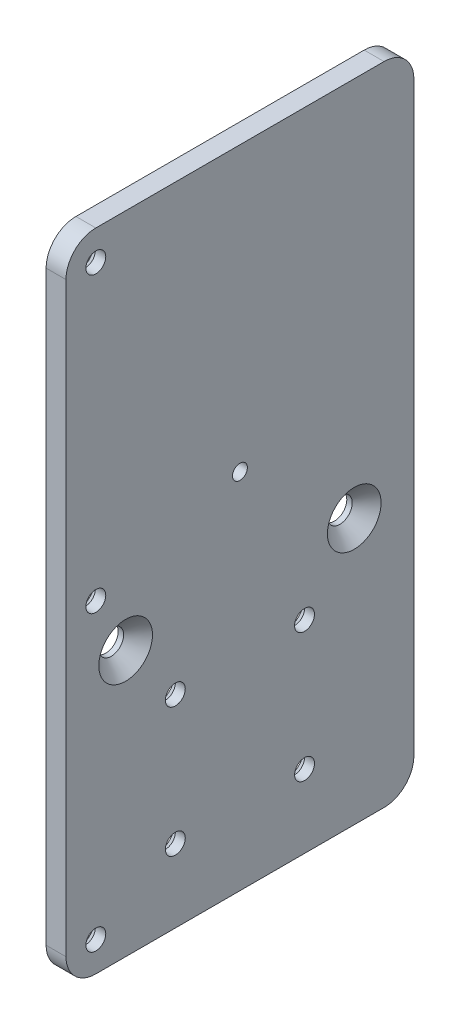
ISO-10303-21;
HEADER;
FILE_DESCRIPTION(('STEP AP214'),'2;1');
FILE_NAME('part.step','',(''),(''),'','','');
FILE_SCHEMA(('AUTOMOTIVE_DESIGN { 1 0 10303 214 1 1 1 1 }'));
ENDSEC;
DATA;
#1=APPLICATION_CONTEXT('core data for automotive mechanical design processes');
#2=APPLICATION_PROTOCOL_DEFINITION('international standard','automotive_design',2000,#1);
#3=PRODUCT_CONTEXT('',#1,'mechanical');
#4=PRODUCT('Part','Part','',(#3));
#5=PRODUCT_RELATED_PRODUCT_CATEGORY('part','',(#4));
#6=PRODUCT_DEFINITION_FORMATION('','',#4);
#7=PRODUCT_DEFINITION_CONTEXT('part definition',#1,'design');
#8=PRODUCT_DEFINITION('design','',#6,#7);
#9=PRODUCT_DEFINITION_SHAPE('','',#8);
#10=(LENGTH_UNIT() NAMED_UNIT(*) SI_UNIT(.MILLI.,.METRE.));
#11=(NAMED_UNIT(*) PLANE_ANGLE_UNIT() SI_UNIT($,.RADIAN.));
#12=(NAMED_UNIT(*) SI_UNIT($,.STERADIAN.) SOLID_ANGLE_UNIT());
#13=UNCERTAINTY_MEASURE_WITH_UNIT(LENGTH_MEASURE(1.E-05),#10,'distance_accuracy_value','');
#14=(GEOMETRIC_REPRESENTATION_CONTEXT(3) GLOBAL_UNCERTAINTY_ASSIGNED_CONTEXT((#13)) GLOBAL_UNIT_ASSIGNED_CONTEXT((#10,
#11,#12)) REPRESENTATION_CONTEXT('',''));
#15=CARTESIAN_POINT('',(0.,0.,0.));
#16=DIRECTION('',(0.,0.,1.));
#17=DIRECTION('',(1.,0.,0.));
#18=AXIS2_PLACEMENT_3D('',#15,#16,#17);
#19=CARTESIAN_POINT('',(4.,61.0681664666984,19.9981468209628));
#20=DIRECTION('',(0.,0.,-1.));
#21=DIRECTION('',(0.,1.,0.));
#22=AXIS2_PLACEMENT_3D('',#19,#20,#21);
#23=PLANE('',#22);
#24=DIRECTION('',(0.,-1.,0.));
#25=VECTOR('',#24,1.);
#26=CARTESIAN_POINT('',(0.,61.0681664666984,19.9981468209628));
#27=LINE('',#26,#25);
#28=CARTESIAN_POINT('',(0.,55.0681664666984,19.9981468209628));
#29=VERTEX_POINT('',#28);
#30=CARTESIAN_POINT('',(0.,-62.9318335333016,19.9981468209627));
#31=VERTEX_POINT('',#30);
#32=EDGE_CURVE('E131',#29,#31,#27,.T.);
#33=ORIENTED_EDGE('',*,*,#32,.T.);
#34=DIRECTION('',(-1.,0.,0.));
#35=VECTOR('',#34,1.);
#36=CARTESIAN_POINT('',(4.,-62.9318335333016,19.9981468209627));
#37=LINE('',#36,#35);
#38=CARTESIAN_POINT('',(4.,-62.9318335333016,19.9981468209627));
#39=VERTEX_POINT('',#38);
#40=EDGE_CURVE('E153',#31,#39,#37,.F.);
#41=ORIENTED_EDGE('',*,*,#40,.T.);
#42=DIRECTION('',(0.,-1.,0.));
#43=VECTOR('',#42,1.);
#44=CARTESIAN_POINT('',(4.,61.0681664666984,19.9981468209628));
#45=LINE('',#44,#43);
#46=CARTESIAN_POINT('',(4.,55.0681664666984,19.9981468209628));
#47=VERTEX_POINT('',#46);
#48=EDGE_CURVE('E129',#47,#39,#45,.T.);
#49=ORIENTED_EDGE('',*,*,#48,.F.);
#50=DIRECTION('',(-1.,0.,0.));
#51=VECTOR('',#50,1.);
#52=CARTESIAN_POINT('',(4.,55.0681664666984,19.9981468209628));
#53=LINE('',#52,#51);
#54=EDGE_CURVE('E150',#47,#29,#53,.T.);
#55=ORIENTED_EDGE('',*,*,#54,.T.);
#56=EDGE_LOOP('',(#33,#41,#49,#55));
#57=FACE_BOUND('',#56,.T.);
#58=ADVANCED_FACE('F33',(#57),#23,.F.);
#59=CARTESIAN_POINT('',(4.,-68.9318335333016,19.9981468209627));
#60=DIRECTION('',(0.,1.,0.));
#61=DIRECTION('',(0.,0.,1.));
#62=AXIS2_PLACEMENT_3D('',#59,#60,#61);
#63=PLANE('',#62);
#64=DIRECTION('',(0.,0.,-1.));
#65=VECTOR('',#64,1.);
#66=CARTESIAN_POINT('',(0.,-68.9318335333016,19.9981468209627));
#67=LINE('',#66,#65);
#68=CARTESIAN_POINT('',(0.,-68.9318335333016,13.9981468209627));
#69=VERTEX_POINT('',#68);
#70=CARTESIAN_POINT('',(0.,-68.9318335333016,-44.0018531790372));
#71=VERTEX_POINT('',#70);
#72=EDGE_CURVE('E127',#69,#71,#67,.T.);
#73=ORIENTED_EDGE('',*,*,#72,.T.);
#74=DIRECTION('',(-1.,0.,0.));
#75=VECTOR('',#74,1.);
#76=CARTESIAN_POINT('',(4.,-68.9318335333016,-44.0018531790372));
#77=LINE('',#76,#75);
#78=CARTESIAN_POINT('',(4.,-68.9318335333016,-44.0018531790372));
#79=VERTEX_POINT('',#78);
#80=EDGE_CURVE('E105',#71,#79,#77,.F.);
#81=ORIENTED_EDGE('',*,*,#80,.T.);
#82=DIRECTION('',(0.,0.,-1.));
#83=VECTOR('',#82,1.);
#84=CARTESIAN_POINT('',(4.,-68.9318335333016,19.9981468209627));
#85=LINE('',#84,#83);
#86=CARTESIAN_POINT('',(4.,-68.9318335333016,13.9981468209627));
#87=VERTEX_POINT('',#86);
#88=EDGE_CURVE('E279',#87,#79,#85,.T.);
#89=ORIENTED_EDGE('',*,*,#88,.F.);
#90=DIRECTION('',(-1.,0.,0.));
#91=VECTOR('',#90,1.);
#92=CARTESIAN_POINT('',(4.,-68.9318335333016,13.9981468209627));
#93=LINE('',#92,#91);
#94=EDGE_CURVE('E110',#87,#69,#93,.T.);
#95=ORIENTED_EDGE('',*,*,#94,.T.);
#96=EDGE_LOOP('',(#73,#81,#89,#95));
#97=FACE_BOUND('',#96,.T.);
#98=ADVANCED_FACE('F298',(#97),#63,.F.);
#99=CARTESIAN_POINT('',(4.,61.0681664666984,-50.0018531790372));
#100=DIRECTION('',(0.,0.,1.));
#101=DIRECTION('',(0.,-1.,0.));
#102=AXIS2_PLACEMENT_3D('',#99,#100,#101);
#103=PLANE('',#102);
#104=DIRECTION('',(0.,1.,0.));
#105=VECTOR('',#104,1.);
#106=CARTESIAN_POINT('',(4.,61.0681664666984,-50.0018531790372));
#107=LINE('',#106,#105);
#108=CARTESIAN_POINT('',(4.,-62.9318335333016,-50.0018531790373));
#109=VERTEX_POINT('',#108);
#110=CARTESIAN_POINT('',(4.,55.0681664666984,-50.0018531790372));
#111=VERTEX_POINT('',#110);
#112=EDGE_CURVE('E119',#109,#111,#107,.T.);
#113=ORIENTED_EDGE('',*,*,#112,.F.);
#114=DIRECTION('',(-1.,0.,0.));
#115=VECTOR('',#114,1.);
#116=CARTESIAN_POINT('',(4.,-62.9318335333016,-50.0018531790373));
#117=LINE('',#116,#115);
#118=CARTESIAN_POINT('',(0.,-62.9318335333016,-50.0018531790373));
#119=VERTEX_POINT('',#118);
#120=EDGE_CURVE('E104',#109,#119,#117,.T.);
#121=ORIENTED_EDGE('',*,*,#120,.T.);
#122=DIRECTION('',(0.,1.,0.));
#123=VECTOR('',#122,1.);
#124=CARTESIAN_POINT('',(0.,61.0681664666984,-50.0018531790372));
#125=LINE('',#124,#123);
#126=CARTESIAN_POINT('',(0.,55.0681664666984,-50.0018531790372));
#127=VERTEX_POINT('',#126);
#128=EDGE_CURVE('E117',#119,#127,#125,.T.);
#129=ORIENTED_EDGE('',*,*,#128,.T.);
#130=DIRECTION('',(-1.,0.,0.));
#131=VECTOR('',#130,1.);
#132=CARTESIAN_POINT('',(4.,55.0681664666984,-50.0018531790372));
#133=LINE('',#132,#131);
#134=EDGE_CURVE('E121',#127,#111,#133,.F.);
#135=ORIENTED_EDGE('',*,*,#134,.T.);
#136=EDGE_LOOP('',(#113,#121,#129,#135));
#137=FACE_BOUND('',#136,.T.);
#138=ADVANCED_FACE('F116',(#137),#103,.F.);
#139=CARTESIAN_POINT('',(4.,61.0681664666984,19.9981468209628));
#140=DIRECTION('',(0.,-1.,0.));
#141=DIRECTION('',(0.,0.,-1.));
#142=AXIS2_PLACEMENT_3D('',#139,#140,#141);
#143=PLANE('',#142);
#144=DIRECTION('',(0.,0.,1.));
#145=VECTOR('',#144,1.);
#146=CARTESIAN_POINT('',(4.,61.0681664666984,19.9981468209628));
#147=LINE('',#146,#145);
#148=CARTESIAN_POINT('',(4.,61.0681664666984,-44.0018531790372));
#149=VERTEX_POINT('',#148);
#150=CARTESIAN_POINT('',(4.,61.0681664666984,13.9981468209628));
#151=VERTEX_POINT('',#150);
#152=EDGE_CURVE('E135',#149,#151,#147,.T.);
#153=ORIENTED_EDGE('',*,*,#152,.F.);
#154=DIRECTION('',(-1.,0.,0.));
#155=VECTOR('',#154,1.);
#156=CARTESIAN_POINT('',(4.,61.0681664666984,-44.0018531790372));
#157=LINE('',#156,#155);
#158=CARTESIAN_POINT('',(0.,61.0681664666984,-44.0018531790372));
#159=VERTEX_POINT('',#158);
#160=EDGE_CURVE('E156',#149,#159,#157,.T.);
#161=ORIENTED_EDGE('',*,*,#160,.T.);
#162=DIRECTION('',(0.,0.,1.));
#163=VECTOR('',#162,1.);
#164=CARTESIAN_POINT('',(0.,61.0681664666984,19.9981468209628));
#165=LINE('',#164,#163);
#166=CARTESIAN_POINT('',(0.,61.0681664666984,13.9981468209628));
#167=VERTEX_POINT('',#166);
#168=EDGE_CURVE('E126',#159,#167,#165,.T.);
#169=ORIENTED_EDGE('',*,*,#168,.T.);
#170=DIRECTION('',(-1.,0.,0.));
#171=VECTOR('',#170,1.);
#172=CARTESIAN_POINT('',(4.,61.0681664666984,13.9981468209628));
#173=LINE('',#172,#171);
#174=EDGE_CURVE('E48',#167,#151,#173,.F.);
#175=ORIENTED_EDGE('',*,*,#174,.T.);
#176=EDGE_LOOP('',(#153,#161,#169,#175));
#177=FACE_BOUND('',#176,.T.);
#178=ADVANCED_FACE('F301',(#177),#143,.F.);
#179=CARTESIAN_POINT('',(4.,0.,0.));
#180=DIRECTION('',(1.,0.,0.));
#181=DIRECTION('',(0.,0.,-1.));
#182=AXIS2_PLACEMENT_3D('',#179,#180,#181);
#183=PLANE('',#182);
#184=CARTESIAN_POINT('',(4.,4.06816646669843,-15.0018531790373));
#185=DIRECTION('',(1.,0.,0.));
#186=DIRECTION('',(0.,0.,-1.));
#187=AXIS2_PLACEMENT_3D('',#184,#185,#186);
#188=CIRCLE('',#187,1.5);
#189=CARTESIAN_POINT('',(4.,4.06816646669843,-16.5018531790373));
#190=VERTEX_POINT('',#189);
#191=EDGE_CURVE('E209',#190,#190,#188,.T.);
#192=ORIENTED_EDGE('',*,*,#191,.F.);
#193=EDGE_LOOP('',(#192));
#194=FACE_BOUND('',#193,.T.);
#195=CARTESIAN_POINT('',(4.,-15.531833533305,-38.0018531790323));
#196=DIRECTION('',(1.,0.,0.));
#197=DIRECTION('',(0.,0.,-1.));
#198=AXIS2_PLACEMENT_3D('',#195,#196,#197);
#199=CIRCLE('',#198,5.40000000000516);
#200=CARTESIAN_POINT('',(4.,-15.531833533305,-43.4018531790375));
#201=VERTEX_POINT('',#200);
#202=EDGE_CURVE('E41',#201,#201,#199,.F.);
#203=ORIENTED_EDGE('',*,*,#202,.T.);
#204=EDGE_LOOP('',(#203));
#205=FACE_BOUND('',#204,.T.);
#206=CARTESIAN_POINT('',(4.,-15.531833533305,7.99814682096768));
#207=DIRECTION('',(1.,0.,0.));
#208=DIRECTION('',(0.,0.,-1.));
#209=AXIS2_PLACEMENT_3D('',#206,#207,#208);
#210=CIRCLE('',#209,5.40000000000512);
#211=CARTESIAN_POINT('',(4.,-15.531833533305,2.59814682096255));
#212=VERTEX_POINT('',#211);
#213=EDGE_CURVE('E212',#212,#212,#210,.F.);
#214=ORIENTED_EDGE('',*,*,#213,.T.);
#215=EDGE_LOOP('',(#214));
#216=FACE_BOUND('',#215,.T.);
#217=CARTESIAN_POINT('',(4.,-3.93183353330157,13.9981468209628));
#218=DIRECTION('',(1.,0.,0.));
#219=DIRECTION('',(0.,0.,-1.));
#220=AXIS2_PLACEMENT_3D('',#217,#218,#219);
#221=CIRCLE('',#220,2.);
#222=CARTESIAN_POINT('',(4.,-3.93183353330157,11.9981468209628));
#223=VERTEX_POINT('',#222);
#224=EDGE_CURVE('E205',#223,#223,#221,.T.);
#225=ORIENTED_EDGE('',*,*,#224,.F.);
#226=EDGE_LOOP('',(#225));
#227=FACE_BOUND('',#226,.T.);
#228=CARTESIAN_POINT('',(4.,-62.9318335333016,13.9981468209627));
#229=DIRECTION('',(1.,0.,0.));
#230=DIRECTION('',(0.,0.,-1.));
#231=AXIS2_PLACEMENT_3D('',#228,#229,#230);
#232=CIRCLE('',#231,2.);
#233=CARTESIAN_POINT('',(4.,-62.9318335333016,11.9981468209627));
#234=VERTEX_POINT('',#233);
#235=EDGE_CURVE('E364',#234,#234,#232,.T.);
#236=ORIENTED_EDGE('',*,*,#235,.F.);
#237=EDGE_LOOP('',(#236));
#238=FACE_BOUND('',#237,.T.);
#239=CARTESIAN_POINT('',(4.,55.0681664666984,13.9981468209628));
#240=DIRECTION('',(1.,0.,0.));
#241=DIRECTION('',(0.,0.,-1.));
#242=AXIS2_PLACEMENT_3D('',#239,#240,#241);
#243=CIRCLE('',#242,2.);
#244=CARTESIAN_POINT('',(4.,55.0681664666984,11.9981468209628));
#245=VERTEX_POINT('',#244);
#246=EDGE_CURVE('E366',#245,#245,#243,.T.);
#247=ORIENTED_EDGE('',*,*,#246,.F.);
#248=EDGE_LOOP('',(#247));
#249=FACE_BOUND('',#248,.T.);
#250=CARTESIAN_POINT('',(4.,-54.2317335333019,-2.00165317903681));
#251=DIRECTION('',(1.,0.,0.));
#252=DIRECTION('',(0.,0.,-1.));
#253=AXIS2_PLACEMENT_3D('',#250,#251,#252);
#254=CIRCLE('',#253,2.);
#255=CARTESIAN_POINT('',(4.,-54.2317335333019,-4.00165317903681));
#256=VERTEX_POINT('',#255);
#257=EDGE_CURVE('E369',#256,#256,#254,.T.);
#258=ORIENTED_EDGE('',*,*,#257,.F.);
#259=EDGE_LOOP('',(#258));
#260=FACE_BOUND('',#259,.T.);
#261=CARTESIAN_POINT('',(4.,-28.2317335333019,-2.00165317903681));
#262=DIRECTION('',(1.,0.,0.));
#263=DIRECTION('',(0.,0.,-1.));
#264=AXIS2_PLACEMENT_3D('',#261,#262,#263);
#265=CIRCLE('',#264,2.);
#266=CARTESIAN_POINT('',(4.,-28.2317335333019,-4.00165317903681));
#267=VERTEX_POINT('',#266);
#268=EDGE_CURVE('E273',#267,#267,#265,.T.);
#269=ORIENTED_EDGE('',*,*,#268,.F.);
#270=EDGE_LOOP('',(#269));
#271=FACE_BOUND('',#270,.T.);
#272=CARTESIAN_POINT('',(4.,-54.2317335333019,-28.0016531790368));
#273=DIRECTION('',(1.,0.,0.));
#274=DIRECTION('',(0.,0.,-1.));
#275=AXIS2_PLACEMENT_3D('',#272,#273,#274);
#276=CIRCLE('',#275,2.00000000000001);
#277=CARTESIAN_POINT('',(4.,-54.2317335333019,-30.0016531790368));
#278=VERTEX_POINT('',#277);
#279=EDGE_CURVE('E269',#278,#278,#276,.T.);
#280=ORIENTED_EDGE('',*,*,#279,.F.);
#281=EDGE_LOOP('',(#280));
#282=FACE_BOUND('',#281,.T.);
#283=CARTESIAN_POINT('',(4.,-28.2317335333019,-28.0016531790368));
#284=DIRECTION('',(1.,0.,0.));
#285=DIRECTION('',(0.,0.,-1.));
#286=AXIS2_PLACEMENT_3D('',#283,#284,#285);
#287=CIRCLE('',#286,2.);
#288=CARTESIAN_POINT('',(4.,-28.2317335333019,-30.0016531790368));
#289=VERTEX_POINT('',#288);
#290=EDGE_CURVE('E267',#289,#289,#287,.T.);
#291=ORIENTED_EDGE('',*,*,#290,.F.);
#292=EDGE_LOOP('',(#291));
#293=FACE_BOUND('',#292,.T.);
#294=ORIENTED_EDGE('',*,*,#88,.T.);
#295=CARTESIAN_POINT('',(4.,-62.9318335333016,-44.0018531790373));
#296=DIRECTION('',(1.,0.,0.));
#297=DIRECTION('',(0.,0.,-1.));
#298=AXIS2_PLACEMENT_3D('',#295,#296,#297);
#299=CIRCLE('',#298,6.);
#300=EDGE_CURVE('E148',#79,#109,#299,.T.);
#301=ORIENTED_EDGE('',*,*,#300,.T.);
#302=ORIENTED_EDGE('',*,*,#112,.T.);
#303=CARTESIAN_POINT('',(4.,55.0681664666984,-44.0018531790372));
#304=DIRECTION('',(1.,0.,0.));
#305=DIRECTION('',(0.,0.,-1.));
#306=AXIS2_PLACEMENT_3D('',#303,#304,#305);
#307=CIRCLE('',#306,6.);
#308=EDGE_CURVE('E55',#111,#149,#307,.T.);
#309=ORIENTED_EDGE('',*,*,#308,.T.);
#310=ORIENTED_EDGE('',*,*,#152,.T.);
#311=CARTESIAN_POINT('',(4.,55.0681664666984,13.9981468209628));
#312=DIRECTION('',(1.,0.,0.));
#313=DIRECTION('',(0.,0.,-1.));
#314=AXIS2_PLACEMENT_3D('',#311,#312,#313);
#315=CIRCLE('',#314,6.);
#316=EDGE_CURVE('E143',#151,#47,#315,.T.);
#317=ORIENTED_EDGE('',*,*,#316,.T.);
#318=ORIENTED_EDGE('',*,*,#48,.T.);
#319=CARTESIAN_POINT('',(4.,-62.9318335333016,13.9981468209627));
#320=DIRECTION('',(1.,0.,0.));
#321=DIRECTION('',(0.,0.,-1.));
#322=AXIS2_PLACEMENT_3D('',#319,#320,#321);
#323=CIRCLE('',#322,6.);
#324=EDGE_CURVE('E146',#39,#87,#323,.T.);
#325=ORIENTED_EDGE('',*,*,#324,.T.);
#326=EDGE_LOOP('',(#294,#301,#302,#309,#310,#317,#318,#325));
#327=FACE_BOUND('',#326,.T.);
#328=ADVANCED_FACE('F217',(#194,#205,#216,#227,#238,#249,#260,#271,#282,#293,#327),#183,.T.);
#329=CARTESIAN_POINT('',(0.,0.,0.));
#330=DIRECTION('',(1.,0.,0.));
#331=DIRECTION('',(0.,0.,-1.));
#332=AXIS2_PLACEMENT_3D('',#329,#330,#331);
#333=PLANE('',#332);
#334=CARTESIAN_POINT('',(0.,4.06816646669843,-15.0018531790373));
#335=DIRECTION('',(-1.,0.,0.));
#336=DIRECTION('',(0.,0.,1.));
#337=AXIS2_PLACEMENT_3D('',#334,#335,#336);
#338=CIRCLE('',#337,1.5);
#339=CARTESIAN_POINT('',(0.,4.06816646669843,-13.5018531790373));
#340=VERTEX_POINT('',#339);
#341=EDGE_CURVE('E414',#340,#340,#338,.T.);
#342=ORIENTED_EDGE('',*,*,#341,.F.);
#343=EDGE_LOOP('',(#342));
#344=FACE_BOUND('',#343,.T.);
#345=CARTESIAN_POINT('',(0.,-15.531833533305,-38.0018531790323));
#346=DIRECTION('',(1.,0.,0.));
#347=DIRECTION('',(0.,0.,-1.));
#348=AXIS2_PLACEMENT_3D('',#345,#346,#347);
#349=CIRCLE('',#348,2.50000000000512);
#350=CARTESIAN_POINT('',(0.,-15.531833533305,-40.5018531790374));
#351=VERTEX_POINT('',#350);
#352=EDGE_CURVE('E206',#351,#351,#349,.T.);
#353=ORIENTED_EDGE('',*,*,#352,.T.);
#354=EDGE_LOOP('',(#353));
#355=FACE_BOUND('',#354,.T.);
#356=CARTESIAN_POINT('',(0.,-15.531833533305,7.99814682096768));
#357=DIRECTION('',(1.,0.,0.));
#358=DIRECTION('',(0.,0.,-1.));
#359=AXIS2_PLACEMENT_3D('',#356,#357,#358);
#360=CIRCLE('',#359,2.50000000000512);
#361=CARTESIAN_POINT('',(0.,-15.531833533305,5.49814682096256));
#362=VERTEX_POINT('',#361);
#363=EDGE_CURVE('E202',#362,#362,#360,.T.);
#364=ORIENTED_EDGE('',*,*,#363,.T.);
#365=EDGE_LOOP('',(#364));
#366=FACE_BOUND('',#365,.T.);
#367=CARTESIAN_POINT('',(0.,55.0681664666984,13.9981468209628));
#368=DIRECTION('',(1.,0.,0.));
#369=DIRECTION('',(0.,0.,-1.));
#370=AXIS2_PLACEMENT_3D('',#367,#368,#369);
#371=CIRCLE('',#370,3.9);
#372=CARTESIAN_POINT('',(0.,55.0681664666984,10.0981468209628));
#373=VERTEX_POINT('',#372);
#374=EDGE_CURVE('E192',#373,#373,#371,.T.);
#375=ORIENTED_EDGE('',*,*,#374,.T.);
#376=EDGE_LOOP('',(#375));
#377=FACE_BOUND('',#376,.T.);
#378=CARTESIAN_POINT('',(0.,-3.93183353330157,13.9981468209628));
#379=DIRECTION('',(1.,0.,0.));
#380=DIRECTION('',(0.,0.,-1.));
#381=AXIS2_PLACEMENT_3D('',#378,#379,#380);
#382=CIRCLE('',#381,3.9);
#383=CARTESIAN_POINT('',(0.,-3.93183353330157,10.0981468209628));
#384=VERTEX_POINT('',#383);
#385=EDGE_CURVE('E189',#384,#384,#382,.T.);
#386=ORIENTED_EDGE('',*,*,#385,.T.);
#387=EDGE_LOOP('',(#386));
#388=FACE_BOUND('',#387,.T.);
#389=CARTESIAN_POINT('',(0.,-62.9318335333016,13.9981468209627));
#390=DIRECTION('',(1.,0.,0.));
#391=DIRECTION('',(0.,0.,-1.));
#392=AXIS2_PLACEMENT_3D('',#389,#390,#391);
#393=CIRCLE('',#392,3.9);
#394=CARTESIAN_POINT('',(0.,-62.9318335333016,10.0981468209627));
#395=VERTEX_POINT('',#394);
#396=EDGE_CURVE('E186',#395,#395,#393,.T.);
#397=ORIENTED_EDGE('',*,*,#396,.T.);
#398=EDGE_LOOP('',(#397));
#399=FACE_BOUND('',#398,.T.);
#400=CARTESIAN_POINT('',(0.,-54.2317335333019,-2.00165317903681));
#401=DIRECTION('',(1.,0.,0.));
#402=DIRECTION('',(0.,0.,-1.));
#403=AXIS2_PLACEMENT_3D('',#400,#401,#402);
#404=CIRCLE('',#403,4.00000000000006);
#405=CARTESIAN_POINT('',(0.,-54.2317335333019,-6.00165317903687));
#406=VERTEX_POINT('',#405);
#407=EDGE_CURVE('E171',#406,#406,#404,.T.);
#408=ORIENTED_EDGE('',*,*,#407,.T.);
#409=EDGE_LOOP('',(#408));
#410=FACE_BOUND('',#409,.T.);
#411=CARTESIAN_POINT('',(0.,-28.2317335333019,-2.00165317903681));
#412=DIRECTION('',(1.,0.,0.));
#413=DIRECTION('',(0.,0.,-1.));
#414=AXIS2_PLACEMENT_3D('',#411,#412,#413);
#415=CIRCLE('',#414,4.00000000000006);
#416=CARTESIAN_POINT('',(0.,-28.2317335333019,-6.00165317903687));
#417=VERTEX_POINT('',#416);
#418=EDGE_CURVE('E168',#417,#417,#415,.T.);
#419=ORIENTED_EDGE('',*,*,#418,.T.);
#420=EDGE_LOOP('',(#419));
#421=FACE_BOUND('',#420,.T.);
#422=CARTESIAN_POINT('',(0.,-54.2317335333019,-28.0016531790368));
#423=DIRECTION('',(1.,0.,0.));
#424=DIRECTION('',(0.,0.,-1.));
#425=AXIS2_PLACEMENT_3D('',#422,#423,#424);
#426=CIRCLE('',#425,4.00000000000006);
#427=CARTESIAN_POINT('',(0.,-54.2317335333019,-32.0016531790369));
#428=VERTEX_POINT('',#427);
#429=EDGE_CURVE('E165',#428,#428,#426,.T.);
#430=ORIENTED_EDGE('',*,*,#429,.T.);
#431=EDGE_LOOP('',(#430));
#432=FACE_BOUND('',#431,.T.);
#433=CARTESIAN_POINT('',(0.,-28.2317335333019,-28.0016531790368));
#434=DIRECTION('',(1.,0.,0.));
#435=DIRECTION('',(0.,0.,-1.));
#436=AXIS2_PLACEMENT_3D('',#433,#434,#435);
#437=CIRCLE('',#436,4.00000000000002);
#438=CARTESIAN_POINT('',(0.,-28.2317335333019,-32.0016531790368));
#439=VERTEX_POINT('',#438);
#440=EDGE_CURVE('E162',#439,#439,#437,.T.);
#441=ORIENTED_EDGE('',*,*,#440,.T.);
#442=EDGE_LOOP('',(#441));
#443=FACE_BOUND('',#442,.T.);
#444=ORIENTED_EDGE('',*,*,#128,.F.);
#445=CARTESIAN_POINT('',(0.,-62.9318335333016,-44.0018531790373));
#446=DIRECTION('',(1.,0.,0.));
#447=DIRECTION('',(0.,0.,-1.));
#448=AXIS2_PLACEMENT_3D('',#445,#446,#447);
#449=CIRCLE('',#448,6.);
#450=EDGE_CURVE('E100',#119,#71,#449,.F.);
#451=ORIENTED_EDGE('',*,*,#450,.T.);
#452=ORIENTED_EDGE('',*,*,#72,.F.);
#453=CARTESIAN_POINT('',(0.,-62.9318335333016,13.9981468209627));
#454=DIRECTION('',(1.,0.,0.));
#455=DIRECTION('',(0.,0.,-1.));
#456=AXIS2_PLACEMENT_3D('',#453,#454,#455);
#457=CIRCLE('',#456,6.);
#458=EDGE_CURVE('E111',#69,#31,#457,.F.);
#459=ORIENTED_EDGE('',*,*,#458,.T.);
#460=ORIENTED_EDGE('',*,*,#32,.F.);
#461=CARTESIAN_POINT('',(0.,55.0681664666984,13.9981468209628));
#462=DIRECTION('',(1.,0.,0.));
#463=DIRECTION('',(0.,0.,-1.));
#464=AXIS2_PLACEMENT_3D('',#461,#462,#463);
#465=CIRCLE('',#464,6.);
#466=EDGE_CURVE('E120',#29,#167,#465,.F.);
#467=ORIENTED_EDGE('',*,*,#466,.T.);
#468=ORIENTED_EDGE('',*,*,#168,.F.);
#469=CARTESIAN_POINT('',(0.,55.0681664666984,-44.0018531790372));
#470=DIRECTION('',(1.,0.,0.));
#471=DIRECTION('',(0.,0.,-1.));
#472=AXIS2_PLACEMENT_3D('',#469,#470,#471);
#473=CIRCLE('',#472,6.);
#474=EDGE_CURVE('E125',#159,#127,#473,.F.);
#475=ORIENTED_EDGE('',*,*,#474,.T.);
#476=EDGE_LOOP('',(#444,#451,#452,#459,#460,#467,#468,#475));
#477=FACE_BOUND('',#476,.T.);
#478=ADVANCED_FACE('F123',(#344,#355,#366,#377,#388,#399,#410,#421,#432,#443,#477),#333,.F.);
#479=CARTESIAN_POINT('',(10.,-28.2317335333019,-28.0016531790368));
#480=DIRECTION('',(-1.,0.,0.));
#481=DIRECTION('',(0.,0.,1.));
#482=AXIS2_PLACEMENT_3D('',#479,#480,#481);
#483=CYLINDRICAL_SURFACE('',#482,2.);
#484=CARTESIAN_POINT('',(2.,-28.2317335333019,-28.0016531790368));
#485=DIRECTION('',(1.,0.,0.));
#486=DIRECTION('',(0.,0.,-1.));
#487=AXIS2_PLACEMENT_3D('',#484,#485,#486);
#488=CIRCLE('',#487,2.);
#489=CARTESIAN_POINT('',(2.,-28.2317335333019,-30.0016531790368));
#490=VERTEX_POINT('',#489);
#491=EDGE_CURVE('E180',#490,#490,#488,.F.);
#492=ORIENTED_EDGE('',*,*,#491,.T.);
#493=EDGE_LOOP('',(#492));
#494=FACE_BOUND('',#493,.T.);
#495=ORIENTED_EDGE('',*,*,#290,.T.);
#496=EDGE_LOOP('',(#495));
#497=FACE_BOUND('',#496,.T.);
#498=ADVANCED_FACE('F234',(#494,#497),#483,.F.);
#499=CARTESIAN_POINT('',(10.,-54.2317335333019,-28.0016531790368));
#500=DIRECTION('',(-1.,0.,0.));
#501=DIRECTION('',(0.,0.,1.));
#502=AXIS2_PLACEMENT_3D('',#499,#500,#501);
#503=CYLINDRICAL_SURFACE('',#502,2.00000000000001);
#504=CARTESIAN_POINT('',(2.00000000000003,-54.2317335333019,-28.0016531790368));
#505=DIRECTION('',(1.,0.,0.));
#506=DIRECTION('',(0.,0.,-1.));
#507=AXIS2_PLACEMENT_3D('',#504,#505,#506);
#508=CIRCLE('',#507,2.00000000000001);
#509=CARTESIAN_POINT('',(2.00000000000003,-54.2317335333019,-30.0016531790368));
#510=VERTEX_POINT('',#509);
#511=EDGE_CURVE('E177',#510,#510,#508,.F.);
#512=ORIENTED_EDGE('',*,*,#511,.T.);
#513=EDGE_LOOP('',(#512));
#514=FACE_BOUND('',#513,.T.);
#515=ORIENTED_EDGE('',*,*,#279,.T.);
#516=EDGE_LOOP('',(#515));
#517=FACE_BOUND('',#516,.T.);
#518=ADVANCED_FACE('F263',(#514,#517),#503,.F.);
#519=CARTESIAN_POINT('',(10.,-28.2317335333019,-2.00165317903681));
#520=DIRECTION('',(-1.,0.,0.));
#521=DIRECTION('',(0.,0.,1.));
#522=AXIS2_PLACEMENT_3D('',#519,#520,#521);
#523=CYLINDRICAL_SURFACE('',#522,2.);
#524=CARTESIAN_POINT('',(2.00000000000003,-28.2317335333019,-2.00165317903681));
#525=DIRECTION('',(1.,0.,0.));
#526=DIRECTION('',(0.,0.,-1.));
#527=AXIS2_PLACEMENT_3D('',#524,#525,#526);
#528=CIRCLE('',#527,2.);
#529=CARTESIAN_POINT('',(2.00000000000003,-28.2317335333019,-4.00165317903681));
#530=VERTEX_POINT('',#529);
#531=EDGE_CURVE('E174',#530,#530,#528,.F.);
#532=ORIENTED_EDGE('',*,*,#531,.T.);
#533=EDGE_LOOP('',(#532));
#534=FACE_BOUND('',#533,.T.);
#535=ORIENTED_EDGE('',*,*,#268,.T.);
#536=EDGE_LOOP('',(#535));
#537=FACE_BOUND('',#536,.T.);
#538=ADVANCED_FACE('F379',(#534,#537),#523,.F.);
#539=CARTESIAN_POINT('',(10.,-54.2317335333019,-2.00165317903681));
#540=DIRECTION('',(-1.,0.,0.));
#541=DIRECTION('',(0.,0.,1.));
#542=AXIS2_PLACEMENT_3D('',#539,#540,#541);
#543=CYLINDRICAL_SURFACE('',#542,2.);
#544=CARTESIAN_POINT('',(2.00000000000003,-54.2317335333019,-2.00165317903681));
#545=DIRECTION('',(1.,0.,0.));
#546=DIRECTION('',(0.,0.,-1.));
#547=AXIS2_PLACEMENT_3D('',#544,#545,#546);
#548=CIRCLE('',#547,2.);
#549=CARTESIAN_POINT('',(2.00000000000003,-54.2317335333019,-4.00165317903681));
#550=VERTEX_POINT('',#549);
#551=EDGE_CURVE('E159',#550,#550,#548,.F.);
#552=ORIENTED_EDGE('',*,*,#551,.T.);
#553=EDGE_LOOP('',(#552));
#554=FACE_BOUND('',#553,.T.);
#555=ORIENTED_EDGE('',*,*,#257,.T.);
#556=EDGE_LOOP('',(#555));
#557=FACE_BOUND('',#556,.T.);
#558=ADVANCED_FACE('F320',(#554,#557),#543,.F.);
#559=CARTESIAN_POINT('',(4.,-62.9318335333016,-44.0018531790373));
#560=DIRECTION('',(-1.,0.,0.));
#561=DIRECTION('',(0.,0.,1.));
#562=AXIS2_PLACEMENT_3D('',#559,#560,#561);
#563=CYLINDRICAL_SURFACE('',#562,6.);
#564=ORIENTED_EDGE('',*,*,#300,.F.);
#565=ORIENTED_EDGE('',*,*,#80,.F.);
#566=ORIENTED_EDGE('',*,*,#450,.F.);
#567=ORIENTED_EDGE('',*,*,#120,.F.);
#568=EDGE_LOOP('',(#564,#565,#566,#567));
#569=FACE_BOUND('',#568,.T.);
#570=ADVANCED_FACE('F103',(#569),#563,.T.);
#571=CARTESIAN_POINT('',(4.,-62.9318335333016,13.9981468209627));
#572=DIRECTION('',(-1.,0.,0.));
#573=DIRECTION('',(0.,0.,1.));
#574=AXIS2_PLACEMENT_3D('',#571,#572,#573);
#575=CYLINDRICAL_SURFACE('',#574,6.);
#576=ORIENTED_EDGE('',*,*,#324,.F.);
#577=ORIENTED_EDGE('',*,*,#40,.F.);
#578=ORIENTED_EDGE('',*,*,#458,.F.);
#579=ORIENTED_EDGE('',*,*,#94,.F.);
#580=EDGE_LOOP('',(#576,#577,#578,#579));
#581=FACE_BOUND('',#580,.T.);
#582=ADVANCED_FACE('F295',(#581),#575,.T.);
#583=CARTESIAN_POINT('',(4.,55.0681664666984,-44.0018531790372));
#584=DIRECTION('',(-1.,0.,0.));
#585=DIRECTION('',(0.,0.,1.));
#586=AXIS2_PLACEMENT_3D('',#583,#584,#585);
#587=CYLINDRICAL_SURFACE('',#586,6.);
#588=ORIENTED_EDGE('',*,*,#308,.F.);
#589=ORIENTED_EDGE('',*,*,#134,.F.);
#590=ORIENTED_EDGE('',*,*,#474,.F.);
#591=ORIENTED_EDGE('',*,*,#160,.F.);
#592=EDGE_LOOP('',(#588,#589,#590,#591));
#593=FACE_BOUND('',#592,.T.);
#594=ADVANCED_FACE('F300',(#593),#587,.T.);
#595=CARTESIAN_POINT('',(4.,55.0681664666984,13.9981468209628));
#596=DIRECTION('',(-1.,0.,0.));
#597=DIRECTION('',(0.,0.,1.));
#598=AXIS2_PLACEMENT_3D('',#595,#596,#597);
#599=CYLINDRICAL_SURFACE('',#598,6.);
#600=ORIENTED_EDGE('',*,*,#316,.F.);
#601=ORIENTED_EDGE('',*,*,#174,.F.);
#602=ORIENTED_EDGE('',*,*,#466,.F.);
#603=ORIENTED_EDGE('',*,*,#54,.F.);
#604=EDGE_LOOP('',(#600,#601,#602,#603));
#605=FACE_BOUND('',#604,.T.);
#606=ADVANCED_FACE('F288',(#605),#599,.T.);
#607=CARTESIAN_POINT('',(2.00000000000003,-54.2317335333019,-2.00165317903681));
#608=DIRECTION('',(-1.,0.,0.));
#609=DIRECTION('',(0.,0.,1.));
#610=AXIS2_PLACEMENT_3D('',#607,#608,#609);
#611=CONICAL_SURFACE('',#610,2.,0.785398163397454);
#612=ORIENTED_EDGE('',*,*,#407,.F.);
#613=EDGE_LOOP('',(#612));
#614=FACE_BOUND('',#613,.T.);
#615=ORIENTED_EDGE('',*,*,#551,.F.);
#616=EDGE_LOOP('',(#615));
#617=FACE_BOUND('',#616,.T.);
#618=ADVANCED_FACE('F327',(#614,#617),#611,.F.);
#619=CARTESIAN_POINT('',(2.00000000000003,-28.2317335333019,-2.00165317903681));
#620=DIRECTION('',(-1.,0.,0.));
#621=DIRECTION('',(0.,0.,1.));
#622=AXIS2_PLACEMENT_3D('',#619,#620,#621);
#623=CONICAL_SURFACE('',#622,2.,0.785398163397454);
#624=ORIENTED_EDGE('',*,*,#418,.F.);
#625=EDGE_LOOP('',(#624));
#626=FACE_BOUND('',#625,.T.);
#627=ORIENTED_EDGE('',*,*,#531,.F.);
#628=EDGE_LOOP('',(#627));
#629=FACE_BOUND('',#628,.T.);
#630=ADVANCED_FACE('F330',(#626,#629),#623,.F.);
#631=CARTESIAN_POINT('',(2.00000000000003,-54.2317335333019,-28.0016531790368));
#632=DIRECTION('',(-1.,0.,0.));
#633=DIRECTION('',(0.,0.,1.));
#634=AXIS2_PLACEMENT_3D('',#631,#632,#633);
#635=CONICAL_SURFACE('',#634,2.00000000000001,0.785398163397454);
#636=ORIENTED_EDGE('',*,*,#429,.F.);
#637=EDGE_LOOP('',(#636));
#638=FACE_BOUND('',#637,.T.);
#639=ORIENTED_EDGE('',*,*,#511,.F.);
#640=EDGE_LOOP('',(#639));
#641=FACE_BOUND('',#640,.T.);
#642=ADVANCED_FACE('F257',(#638,#641),#635,.F.);
#643=CARTESIAN_POINT('',(2.,-28.2317335333019,-28.0016531790368));
#644=DIRECTION('',(-1.,0.,0.));
#645=DIRECTION('',(0.,0.,1.));
#646=AXIS2_PLACEMENT_3D('',#643,#644,#645);
#647=CONICAL_SURFACE('',#646,2.,0.785398163397454);
#648=ORIENTED_EDGE('',*,*,#440,.F.);
#649=EDGE_LOOP('',(#648));
#650=FACE_BOUND('',#649,.T.);
#651=ORIENTED_EDGE('',*,*,#491,.F.);
#652=EDGE_LOOP('',(#651));
#653=FACE_BOUND('',#652,.T.);
#654=ADVANCED_FACE('F253',(#650,#653),#647,.F.);
#655=CARTESIAN_POINT('',(15.,55.0681664666984,13.9981468209628));
#656=DIRECTION('',(-1.,0.,0.));
#657=DIRECTION('',(0.,0.,1.));
#658=AXIS2_PLACEMENT_3D('',#655,#656,#657);
#659=CYLINDRICAL_SURFACE('',#658,2.);
#660=CARTESIAN_POINT('',(1.89999999999999,55.0681664666984,13.9981468209628));
#661=DIRECTION('',(1.,0.,0.));
#662=DIRECTION('',(0.,0.,-1.));
#663=AXIS2_PLACEMENT_3D('',#660,#661,#662);
#664=CIRCLE('',#663,2.);
#665=CARTESIAN_POINT('',(1.89999999999999,55.0681664666984,11.9981468209628));
#666=VERTEX_POINT('',#665);
#667=EDGE_CURVE('E183',#666,#666,#664,.F.);
#668=ORIENTED_EDGE('',*,*,#667,.T.);
#669=EDGE_LOOP('',(#668));
#670=FACE_BOUND('',#669,.T.);
#671=ORIENTED_EDGE('',*,*,#246,.T.);
#672=EDGE_LOOP('',(#671));
#673=FACE_BOUND('',#672,.T.);
#674=ADVANCED_FACE('F256',(#670,#673),#659,.F.);
#675=CARTESIAN_POINT('',(15.,-62.9318335333016,13.9981468209627));
#676=DIRECTION('',(-1.,0.,0.));
#677=DIRECTION('',(0.,0.,1.));
#678=AXIS2_PLACEMENT_3D('',#675,#676,#677);
#679=CYLINDRICAL_SURFACE('',#678,2.);
#680=CARTESIAN_POINT('',(1.89999999999999,-62.9318335333016,13.9981468209627));
#681=DIRECTION('',(1.,0.,0.));
#682=DIRECTION('',(0.,0.,-1.));
#683=AXIS2_PLACEMENT_3D('',#680,#681,#682);
#684=CIRCLE('',#683,2.);
#685=CARTESIAN_POINT('',(1.89999999999999,-62.9318335333016,11.9981468209627));
#686=VERTEX_POINT('',#685);
#687=EDGE_CURVE('E198',#686,#686,#684,.F.);
#688=ORIENTED_EDGE('',*,*,#687,.T.);
#689=EDGE_LOOP('',(#688));
#690=FACE_BOUND('',#689,.T.);
#691=ORIENTED_EDGE('',*,*,#235,.T.);
#692=EDGE_LOOP('',(#691));
#693=FACE_BOUND('',#692,.T.);
#694=ADVANCED_FACE('F358',(#690,#693),#679,.F.);
#695=CARTESIAN_POINT('',(15.,-3.93183353330157,13.9981468209628));
#696=DIRECTION('',(-1.,0.,0.));
#697=DIRECTION('',(0.,0.,1.));
#698=AXIS2_PLACEMENT_3D('',#695,#696,#697);
#699=CYLINDRICAL_SURFACE('',#698,2.);
#700=CARTESIAN_POINT('',(1.89999999999999,-3.93183353330157,13.9981468209628));
#701=DIRECTION('',(1.,0.,0.));
#702=DIRECTION('',(0.,0.,-1.));
#703=AXIS2_PLACEMENT_3D('',#700,#701,#702);
#704=CIRCLE('',#703,2.);
#705=CARTESIAN_POINT('',(1.89999999999999,-3.93183353330157,11.9981468209628));
#706=VERTEX_POINT('',#705);
#707=EDGE_CURVE('E195',#706,#706,#704,.F.);
#708=ORIENTED_EDGE('',*,*,#707,.T.);
#709=EDGE_LOOP('',(#708));
#710=FACE_BOUND('',#709,.T.);
#711=ORIENTED_EDGE('',*,*,#224,.T.);
#712=EDGE_LOOP('',(#711));
#713=FACE_BOUND('',#712,.T.);
#714=ADVANCED_FACE('F342',(#710,#713),#699,.F.);
#715=CARTESIAN_POINT('',(1.89999999999999,55.0681664666984,13.9981468209628));
#716=DIRECTION('',(-1.,0.,0.));
#717=DIRECTION('',(0.,0.,1.));
#718=AXIS2_PLACEMENT_3D('',#715,#716,#717);
#719=CONICAL_SURFACE('',#718,2.,0.78539816339745);
#720=ORIENTED_EDGE('',*,*,#374,.F.);
#721=EDGE_LOOP('',(#720));
#722=FACE_BOUND('',#721,.T.);
#723=ORIENTED_EDGE('',*,*,#667,.F.);
#724=EDGE_LOOP('',(#723));
#725=FACE_BOUND('',#724,.T.);
#726=ADVANCED_FACE('F338',(#722,#725),#719,.F.);
#727=CARTESIAN_POINT('',(1.89999999999999,-3.93183353330157,13.9981468209628));
#728=DIRECTION('',(-1.,0.,0.));
#729=DIRECTION('',(0.,0.,1.));
#730=AXIS2_PLACEMENT_3D('',#727,#728,#729);
#731=CONICAL_SURFACE('',#730,2.,0.78539816339745);
#732=ORIENTED_EDGE('',*,*,#385,.F.);
#733=EDGE_LOOP('',(#732));
#734=FACE_BOUND('',#733,.T.);
#735=ORIENTED_EDGE('',*,*,#707,.F.);
#736=EDGE_LOOP('',(#735));
#737=FACE_BOUND('',#736,.T.);
#738=ADVANCED_FACE('F341',(#734,#737),#731,.F.);
#739=CARTESIAN_POINT('',(1.89999999999999,-62.9318335333016,13.9981468209627));
#740=DIRECTION('',(-1.,0.,0.));
#741=DIRECTION('',(0.,0.,1.));
#742=AXIS2_PLACEMENT_3D('',#739,#740,#741);
#743=CONICAL_SURFACE('',#742,2.,0.78539816339745);
#744=ORIENTED_EDGE('',*,*,#396,.F.);
#745=EDGE_LOOP('',(#744));
#746=FACE_BOUND('',#745,.T.);
#747=ORIENTED_EDGE('',*,*,#687,.F.);
#748=EDGE_LOOP('',(#747));
#749=FACE_BOUND('',#748,.T.);
#750=ADVANCED_FACE('F346',(#746,#749),#743,.F.);
#751=CARTESIAN_POINT('',(-11.,-15.531833533305,7.99814682096768));
#752=DIRECTION('',(1.,0.,0.));
#753=DIRECTION('',(0.,0.,-1.));
#754=AXIS2_PLACEMENT_3D('',#751,#752,#753);
#755=CYLINDRICAL_SURFACE('',#754,2.50000000000512);
#756=CARTESIAN_POINT('',(1.1,-15.531833533305,7.99814682096768));
#757=DIRECTION('',(1.,0.,0.));
#758=DIRECTION('',(0.,0.,-1.));
#759=AXIS2_PLACEMENT_3D('',#756,#757,#758);
#760=CIRCLE('',#759,2.50000000000512);
#761=CARTESIAN_POINT('',(1.1,-15.531833533305,5.49814682096256));
#762=VERTEX_POINT('',#761);
#763=EDGE_CURVE('E11',#762,#762,#760,.T.);
#764=ORIENTED_EDGE('',*,*,#763,.T.);
#765=EDGE_LOOP('',(#764));
#766=FACE_BOUND('',#765,.T.);
#767=ORIENTED_EDGE('',*,*,#363,.F.);
#768=EDGE_LOOP('',(#767));
#769=FACE_BOUND('',#768,.T.);
#770=ADVANCED_FACE('F228',(#766,#769),#755,.F.);
#771=CARTESIAN_POINT('',(-11.,-15.531833533305,-38.0018531790323));
#772=DIRECTION('',(1.,0.,0.));
#773=DIRECTION('',(0.,0.,-1.));
#774=AXIS2_PLACEMENT_3D('',#771,#772,#773);
#775=CYLINDRICAL_SURFACE('',#774,2.50000000000512);
#776=CARTESIAN_POINT('',(1.09999999999996,-15.531833533305,-38.0018531790323));
#777=DIRECTION('',(1.,0.,0.));
#778=DIRECTION('',(0.,0.,-1.));
#779=AXIS2_PLACEMENT_3D('',#776,#777,#778);
#780=CIRCLE('',#779,2.50000000000512);
#781=CARTESIAN_POINT('',(1.09999999999996,-15.531833533305,-40.5018531790374));
#782=VERTEX_POINT('',#781);
#783=EDGE_CURVE('E201',#782,#782,#780,.T.);
#784=ORIENTED_EDGE('',*,*,#783,.T.);
#785=EDGE_LOOP('',(#784));
#786=FACE_BOUND('',#785,.T.);
#787=ORIENTED_EDGE('',*,*,#352,.F.);
#788=EDGE_LOOP('',(#787));
#789=FACE_BOUND('',#788,.T.);
#790=ADVANCED_FACE('F223',(#786,#789),#775,.F.);
#791=CARTESIAN_POINT('',(1.09999999999996,-15.531833533305,-38.0018531790323));
#792=DIRECTION('',(1.,0.,0.));
#793=DIRECTION('',(0.,0.,-1.));
#794=AXIS2_PLACEMENT_3D('',#791,#792,#793);
#795=CONICAL_SURFACE('',#794,2.50000000000512,0.785398163397449);
#796=ORIENTED_EDGE('',*,*,#202,.F.);
#797=EDGE_LOOP('',(#796));
#798=FACE_BOUND('',#797,.T.);
#799=ORIENTED_EDGE('',*,*,#783,.F.);
#800=EDGE_LOOP('',(#799));
#801=FACE_BOUND('',#800,.T.);
#802=ADVANCED_FACE('F220',(#798,#801),#795,.F.);
#803=CARTESIAN_POINT('',(1.1,-15.531833533305,7.99814682096768));
#804=DIRECTION('',(1.,0.,0.));
#805=DIRECTION('',(0.,0.,-1.));
#806=AXIS2_PLACEMENT_3D('',#803,#804,#805);
#807=CONICAL_SURFACE('',#806,2.50000000000512,0.785398163397449);
#808=ORIENTED_EDGE('',*,*,#213,.F.);
#809=EDGE_LOOP('',(#808));
#810=FACE_BOUND('',#809,.T.);
#811=ORIENTED_EDGE('',*,*,#763,.F.);
#812=EDGE_LOOP('',(#811));
#813=FACE_BOUND('',#812,.T.);
#814=ADVANCED_FACE('F35',(#810,#813),#807,.F.);
#815=CARTESIAN_POINT('',(12.,4.06816646669843,-15.0018531790373));
#816=DIRECTION('',(-1.,0.,0.));
#817=DIRECTION('',(0.,0.,1.));
#818=AXIS2_PLACEMENT_3D('',#815,#816,#817);
#819=CYLINDRICAL_SURFACE('',#818,1.5);
#820=ORIENTED_EDGE('',*,*,#191,.T.);
#821=EDGE_LOOP('',(#820));
#822=FACE_BOUND('',#821,.T.);
#823=ORIENTED_EDGE('',*,*,#341,.T.);
#824=EDGE_LOOP('',(#823));
#825=FACE_BOUND('',#824,.T.);
#826=ADVANCED_FACE('F402',(#822,#825),#819,.F.);
#827=CLOSED_SHELL('',(#58,#98,#138,#178,#328,#478,#498,#518,#538,#558,#570,#582,#594,#606,#618,
#630,#642,#654,#674,#694,#714,#726,#738,#750,#770,#790,#802,#814,#826));
#828=MANIFOLD_SOLID_BREP('B2',#827);
#829=ADVANCED_BREP_SHAPE_REPRESENTATION('',(#18,#828),#14);
#830=SHAPE_DEFINITION_REPRESENTATION(#9,#829);
ENDSEC;
END-ISO-10303-21;
